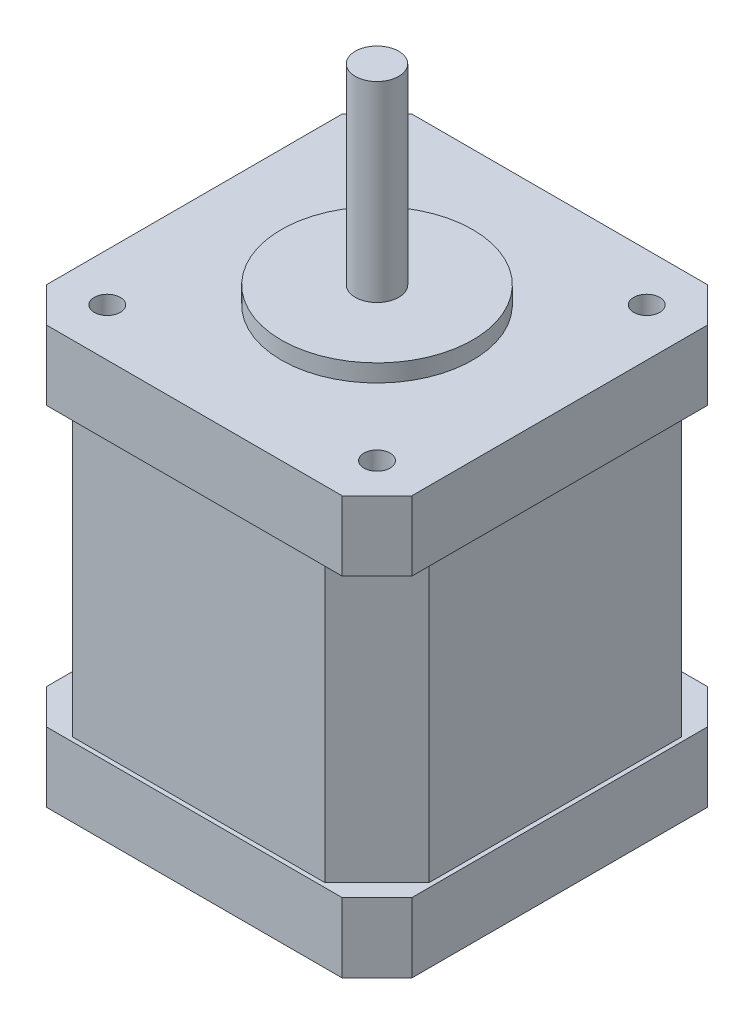
ISO-10303-21;
HEADER;
FILE_DESCRIPTION(('STEP AP214'),'2;1');
FILE_NAME('part.step','',(''),(''),'','','');
FILE_SCHEMA(('AUTOMOTIVE_DESIGN { 1 0 10303 214 1 1 1 1 }'));
ENDSEC;
DATA;
#1=APPLICATION_CONTEXT('core data for automotive mechanical design processes');
#2=APPLICATION_PROTOCOL_DEFINITION('international standard','automotive_design',2000,#1);
#3=PRODUCT_CONTEXT('',#1,'mechanical');
#4=PRODUCT('Part','Part','',(#3));
#5=PRODUCT_RELATED_PRODUCT_CATEGORY('part','',(#4));
#6=PRODUCT_DEFINITION_FORMATION('','',#4);
#7=PRODUCT_DEFINITION_CONTEXT('part definition',#1,'design');
#8=PRODUCT_DEFINITION('design','',#6,#7);
#9=PRODUCT_DEFINITION_SHAPE('','',#8);
#10=(LENGTH_UNIT() NAMED_UNIT(*) SI_UNIT(.MILLI.,.METRE.));
#11=(NAMED_UNIT(*) PLANE_ANGLE_UNIT() SI_UNIT($,.RADIAN.));
#12=(NAMED_UNIT(*) SI_UNIT($,.STERADIAN.) SOLID_ANGLE_UNIT());
#13=UNCERTAINTY_MEASURE_WITH_UNIT(LENGTH_MEASURE(1.E-05),#10,'distance_accuracy_value','');
#14=(GEOMETRIC_REPRESENTATION_CONTEXT(3) GLOBAL_UNCERTAINTY_ASSIGNED_CONTEXT((#13)) GLOBAL_UNIT_ASSIGNED_CONTEXT((#10,
#11,#12)) REPRESENTATION_CONTEXT('',''));
#15=CARTESIAN_POINT('',(0.,0.,0.));
#16=DIRECTION('',(0.,0.,1.));
#17=DIRECTION('',(1.,0.,0.));
#18=AXIS2_PLACEMENT_3D('',#15,#16,#17);
#19=CARTESIAN_POINT('',(0.,10.,0.));
#20=DIRECTION('',(0.,1.,0.));
#21=DIRECTION('',(0.,0.,1.));
#22=AXIS2_PLACEMENT_3D('',#19,#20,#21);
#23=PLANE('',#22);
#24=CARTESIAN_POINT('',(0.,10.,0.));
#25=DIRECTION('',(0.,1.,0.));
#26=DIRECTION('',(0.,0.,1.));
#27=AXIS2_PLACEMENT_3D('',#24,#25,#26);
#28=CIRCLE('',#27,11.);
#29=CARTESIAN_POINT('',(0.,10.,11.));
#30=VERTEX_POINT('',#29);
#31=EDGE_CURVE('E482',#30,#30,#28,.T.);
#32=ORIENTED_EDGE('',*,*,#31,.T.);
#33=EDGE_LOOP('',(#32));
#34=FACE_BOUND('',#33,.T.);
#35=CARTESIAN_POINT('',(0.,10.,0.));
#36=DIRECTION('',(0.,1.,0.));
#37=DIRECTION('',(0.,0.,1.));
#38=AXIS2_PLACEMENT_3D('',#35,#36,#37);
#39=CIRCLE('',#38,2.5);
#40=CARTESIAN_POINT('',(0.,10.,2.5));
#41=VERTEX_POINT('',#40);
#42=EDGE_CURVE('E498',#41,#41,#39,.T.);
#43=ORIENTED_EDGE('',*,*,#42,.F.);
#44=EDGE_LOOP('',(#43));
#45=FACE_BOUND('',#44,.T.);
#46=ADVANCED_FACE('F35',(#34,#45),#23,.T.);
#47=CARTESIAN_POINT('',(0.,8.,0.));
#48=DIRECTION('',(0.,1.,0.));
#49=DIRECTION('',(0.,0.,1.));
#50=AXIS2_PLACEMENT_3D('',#47,#48,#49);
#51=PLANE('',#50);
#52=CARTESIAN_POINT('',(-15.5,8.,15.5));
#53=DIRECTION('',(0.,1.,0.));
#54=DIRECTION('',(0.,0.,1.));
#55=AXIS2_PLACEMENT_3D('',#52,#53,#54);
#56=CIRCLE('',#55,1.5);
#57=CARTESIAN_POINT('',(-15.5,8.,17.));
#58=VERTEX_POINT('',#57);
#59=EDGE_CURVE('E522',#58,#58,#56,.T.);
#60=ORIENTED_EDGE('',*,*,#59,.F.);
#61=EDGE_LOOP('',(#60));
#62=FACE_BOUND('',#61,.T.);
#63=CARTESIAN_POINT('',(15.5,8.,15.5));
#64=DIRECTION('',(0.,1.,0.));
#65=DIRECTION('',(0.,0.,1.));
#66=AXIS2_PLACEMENT_3D('',#63,#64,#65);
#67=CIRCLE('',#66,1.5);
#68=CARTESIAN_POINT('',(15.5,8.,17.));
#69=VERTEX_POINT('',#68);
#70=EDGE_CURVE('E516',#69,#69,#67,.T.);
#71=ORIENTED_EDGE('',*,*,#70,.F.);
#72=EDGE_LOOP('',(#71));
#73=FACE_BOUND('',#72,.T.);
#74=CARTESIAN_POINT('',(15.5,8.,-15.5));
#75=DIRECTION('',(0.,1.,0.));
#76=DIRECTION('',(0.,0.,1.));
#77=AXIS2_PLACEMENT_3D('',#74,#75,#76);
#78=CIRCLE('',#77,1.5);
#79=CARTESIAN_POINT('',(15.5,8.,-14.));
#80=VERTEX_POINT('',#79);
#81=EDGE_CURVE('E510',#80,#80,#78,.T.);
#82=ORIENTED_EDGE('',*,*,#81,.F.);
#83=EDGE_LOOP('',(#82));
#84=FACE_BOUND('',#83,.T.);
#85=CARTESIAN_POINT('',(-15.5,8.,-15.5));
#86=DIRECTION('',(0.,1.,0.));
#87=DIRECTION('',(0.,0.,1.));
#88=AXIS2_PLACEMENT_3D('',#85,#86,#87);
#89=CIRCLE('',#88,1.5);
#90=CARTESIAN_POINT('',(-15.5,8.,-14.));
#91=VERTEX_POINT('',#90);
#92=EDGE_CURVE('E504',#91,#91,#89,.T.);
#93=ORIENTED_EDGE('',*,*,#92,.F.);
#94=EDGE_LOOP('',(#93));
#95=FACE_BOUND('',#94,.T.);
#96=DIRECTION('',(-1.,0.,0.));
#97=VECTOR('',#96,1.);
#98=CARTESIAN_POINT('',(-21.,8.,-21.));
#99=LINE('',#98,#97);
#100=CARTESIAN_POINT('',(17.,8.,-21.));
#101=VERTEX_POINT('',#100);
#102=CARTESIAN_POINT('',(-17.,8.,-21.));
#103=VERTEX_POINT('',#102);
#104=EDGE_CURVE('E208',#101,#103,#99,.T.);
#105=ORIENTED_EDGE('',*,*,#104,.T.);
#106=DIRECTION('',(0.707106781186549,0.,-0.707106781186546));
#107=VECTOR('',#106,1.);
#108=CARTESIAN_POINT('',(-19.,8.,-19.));
#109=LINE('',#108,#107);
#110=CARTESIAN_POINT('',(-21.,8.,-17.));
#111=VERTEX_POINT('',#110);
#112=EDGE_CURVE('E296',#103,#111,#109,.F.);
#113=ORIENTED_EDGE('',*,*,#112,.T.);
#114=DIRECTION('',(0.,0.,1.));
#115=VECTOR('',#114,1.);
#116=CARTESIAN_POINT('',(-21.,8.,-21.));
#117=LINE('',#116,#115);
#118=CARTESIAN_POINT('',(-21.,8.,17.));
#119=VERTEX_POINT('',#118);
#120=EDGE_CURVE('E320',#111,#119,#117,.T.);
#121=ORIENTED_EDGE('',*,*,#120,.T.);
#122=DIRECTION('',(-0.707106781186546,0.,-0.707106781186549));
#123=VECTOR('',#122,1.);
#124=CARTESIAN_POINT('',(-19.,8.,19.));
#125=LINE('',#124,#123);
#126=CARTESIAN_POINT('',(-17.,8.,21.));
#127=VERTEX_POINT('',#126);
#128=EDGE_CURVE('E294',#119,#127,#125,.F.);
#129=ORIENTED_EDGE('',*,*,#128,.T.);
#130=DIRECTION('',(1.,0.,0.));
#131=VECTOR('',#130,1.);
#132=CARTESIAN_POINT('',(-21.,8.,21.));
#133=LINE('',#132,#131);
#134=CARTESIAN_POINT('',(17.,8.,21.));
#135=VERTEX_POINT('',#134);
#136=EDGE_CURVE('E438',#127,#135,#133,.T.);
#137=ORIENTED_EDGE('',*,*,#136,.T.);
#138=DIRECTION('',(-0.707106781186549,0.,0.707106781186546));
#139=VECTOR('',#138,1.);
#140=CARTESIAN_POINT('',(19.,8.,19.));
#141=LINE('',#140,#139);
#142=CARTESIAN_POINT('',(21.,8.,17.));
#143=VERTEX_POINT('',#142);
#144=EDGE_CURVE('E55',#135,#143,#141,.F.);
#145=ORIENTED_EDGE('',*,*,#144,.T.);
#146=DIRECTION('',(0.,0.,-1.));
#147=VECTOR('',#146,1.);
#148=CARTESIAN_POINT('',(21.,8.,-21.));
#149=LINE('',#148,#147);
#150=CARTESIAN_POINT('',(21.,8.,-17.));
#151=VERTEX_POINT('',#150);
#152=EDGE_CURVE('E307',#143,#151,#149,.T.);
#153=ORIENTED_EDGE('',*,*,#152,.T.);
#154=DIRECTION('',(0.707106781186547,0.,0.707106781186548));
#155=VECTOR('',#154,1.);
#156=CARTESIAN_POINT('',(19.,8.,-19.));
#157=LINE('',#156,#155);
#158=EDGE_CURVE('E292',#151,#101,#157,.F.);
#159=ORIENTED_EDGE('',*,*,#158,.T.);
#160=EDGE_LOOP('',(#105,#113,#121,#129,#137,#145,#153,#159));
#161=FACE_BOUND('',#160,.T.);
#162=CARTESIAN_POINT('',(0.,8.,0.));
#163=DIRECTION('',(0.,1.,0.));
#164=DIRECTION('',(0.,0.,1.));
#165=AXIS2_PLACEMENT_3D('',#162,#163,#164);
#166=CIRCLE('',#165,11.);
#167=CARTESIAN_POINT('',(0.,8.,11.));
#168=VERTEX_POINT('',#167);
#169=EDGE_CURVE('E493',#168,#168,#166,.T.);
#170=ORIENTED_EDGE('',*,*,#169,.F.);
#171=EDGE_LOOP('',(#170));
#172=FACE_BOUND('',#171,.T.);
#173=ADVANCED_FACE('F368',(#62,#73,#84,#95,#161,#172),#51,.T.);
#174=CARTESIAN_POINT('',(0.,0.,0.));
#175=DIRECTION('',(0.,1.,0.));
#176=DIRECTION('',(0.,0.,1.));
#177=AXIS2_PLACEMENT_3D('',#174,#175,#176);
#178=PLANE('',#177);
#179=DIRECTION('',(0.,0.,1.));
#180=VECTOR('',#179,1.);
#181=CARTESIAN_POINT('',(-21.,0.,-21.));
#182=LINE('',#181,#180);
#183=CARTESIAN_POINT('',(-21.,0.,-17.));
#184=VERTEX_POINT('',#183);
#185=CARTESIAN_POINT('',(-21.,0.,17.));
#186=VERTEX_POINT('',#185);
#187=EDGE_CURVE('E322',#184,#186,#182,.T.);
#188=ORIENTED_EDGE('',*,*,#187,.F.);
#189=DIRECTION('',(-0.707106781186549,0.,0.707106781186546));
#190=VECTOR('',#189,1.);
#191=CARTESIAN_POINT('',(-21.,0.,-17.));
#192=LINE('',#191,#190);
#193=CARTESIAN_POINT('',(-17.,0.,-21.));
#194=VERTEX_POINT('',#193);
#195=EDGE_CURVE('E284',#184,#194,#192,.F.);
#196=ORIENTED_EDGE('',*,*,#195,.T.);
#197=DIRECTION('',(-1.,0.,0.));
#198=VECTOR('',#197,1.);
#199=CARTESIAN_POINT('',(-21.,0.,-21.));
#200=LINE('',#199,#198);
#201=CARTESIAN_POINT('',(17.,0.,-21.));
#202=VERTEX_POINT('',#201);
#203=EDGE_CURVE('E316',#202,#194,#200,.T.);
#204=ORIENTED_EDGE('',*,*,#203,.F.);
#205=DIRECTION('',(-0.707106781186547,0.,-0.707106781186548));
#206=VECTOR('',#205,1.);
#207=CARTESIAN_POINT('',(17.,0.,-21.));
#208=LINE('',#207,#206);
#209=CARTESIAN_POINT('',(21.,0.,-17.));
#210=VERTEX_POINT('',#209);
#211=EDGE_CURVE('E280',#202,#210,#208,.F.);
#212=ORIENTED_EDGE('',*,*,#211,.T.);
#213=DIRECTION('',(0.,0.,-1.));
#214=VECTOR('',#213,1.);
#215=CARTESIAN_POINT('',(21.,0.,-21.));
#216=LINE('',#215,#214);
#217=CARTESIAN_POINT('',(21.,0.,17.));
#218=VERTEX_POINT('',#217);
#219=EDGE_CURVE('E306',#218,#210,#216,.T.);
#220=ORIENTED_EDGE('',*,*,#219,.F.);
#221=DIRECTION('',(0.707106781186549,0.,-0.707106781186546));
#222=VECTOR('',#221,1.);
#223=CARTESIAN_POINT('',(21.,0.,17.));
#224=LINE('',#223,#222);
#225=CARTESIAN_POINT('',(17.,0.,21.));
#226=VERTEX_POINT('',#225);
#227=EDGE_CURVE('E278',#218,#226,#224,.F.);
#228=ORIENTED_EDGE('',*,*,#227,.T.);
#229=DIRECTION('',(1.,0.,0.));
#230=VECTOR('',#229,1.);
#231=CARTESIAN_POINT('',(-21.,0.,21.));
#232=LINE('',#231,#230);
#233=CARTESIAN_POINT('',(-17.,0.,21.));
#234=VERTEX_POINT('',#233);
#235=EDGE_CURVE('E317',#234,#226,#232,.T.);
#236=ORIENTED_EDGE('',*,*,#235,.F.);
#237=DIRECTION('',(0.707106781186546,0.,0.707106781186549));
#238=VECTOR('',#237,1.);
#239=CARTESIAN_POINT('',(-17.,0.,21.));
#240=LINE('',#239,#238);
#241=EDGE_CURVE('E282',#234,#186,#240,.F.);
#242=ORIENTED_EDGE('',*,*,#241,.T.);
#243=EDGE_LOOP('',(#188,#196,#204,#212,#220,#228,#236,#242));
#244=FACE_BOUND('',#243,.T.);
#245=DIRECTION('',(-1.,0.,0.));
#246=VECTOR('',#245,1.);
#247=CARTESIAN_POINT('',(20.5,0.,20.5));
#248=LINE('',#247,#246);
#249=CARTESIAN_POINT('',(14.5,0.,20.5));
#250=VERTEX_POINT('',#249);
#251=CARTESIAN_POINT('',(-14.5,0.,20.5));
#252=VERTEX_POINT('',#251);
#253=EDGE_CURVE('E454',#250,#252,#248,.T.);
#254=ORIENTED_EDGE('',*,*,#253,.F.);
#255=DIRECTION('',(-0.707106781186546,0.,0.707106781186549));
#256=VECTOR('',#255,1.);
#257=CARTESIAN_POINT('',(17.5,0.,17.5));
#258=LINE('',#257,#256);
#259=CARTESIAN_POINT('',(20.5,0.,14.5));
#260=VERTEX_POINT('',#259);
#261=EDGE_CURVE('E225',#250,#260,#258,.F.);
#262=ORIENTED_EDGE('',*,*,#261,.T.);
#263=DIRECTION('',(0.,0.,1.));
#264=VECTOR('',#263,1.);
#265=CARTESIAN_POINT('',(20.5,0.,-20.5));
#266=LINE('',#265,#264);
#267=CARTESIAN_POINT('',(20.5,0.,-14.5));
#268=VERTEX_POINT('',#267);
#269=EDGE_CURVE('E204',#268,#260,#266,.T.);
#270=ORIENTED_EDGE('',*,*,#269,.F.);
#271=DIRECTION('',(0.707106781186549,0.,0.707106781186546));
#272=VECTOR('',#271,1.);
#273=CARTESIAN_POINT('',(17.4999999999999,0.,-17.5));
#274=LINE('',#273,#272);
#275=CARTESIAN_POINT('',(14.5,0.,-20.5));
#276=VERTEX_POINT('',#275);
#277=EDGE_CURVE('E340',#268,#276,#274,.F.);
#278=ORIENTED_EDGE('',*,*,#277,.T.);
#279=DIRECTION('',(1.,0.,0.));
#280=VECTOR('',#279,1.);
#281=CARTESIAN_POINT('',(-20.5,0.,-20.5));
#282=LINE('',#281,#280);
#283=CARTESIAN_POINT('',(-14.5,0.,-20.5));
#284=VERTEX_POINT('',#283);
#285=EDGE_CURVE('E344',#284,#276,#282,.T.);
#286=ORIENTED_EDGE('',*,*,#285,.F.);
#287=DIRECTION('',(0.707106781186546,0.,-0.707106781186549));
#288=VECTOR('',#287,1.);
#289=CARTESIAN_POINT('',(-17.5,0.,-17.5));
#290=LINE('',#289,#288);
#291=CARTESIAN_POINT('',(-20.5,0.,-14.5));
#292=VERTEX_POINT('',#291);
#293=EDGE_CURVE('E233',#284,#292,#290,.F.);
#294=ORIENTED_EDGE('',*,*,#293,.T.);
#295=DIRECTION('',(0.,0.,-1.));
#296=VECTOR('',#295,1.);
#297=CARTESIAN_POINT('',(-20.5,0.,20.5));
#298=LINE('',#297,#296);
#299=CARTESIAN_POINT('',(-20.5,0.,14.5));
#300=VERTEX_POINT('',#299);
#301=EDGE_CURVE('E351',#300,#292,#298,.T.);
#302=ORIENTED_EDGE('',*,*,#301,.F.);
#303=DIRECTION('',(-0.707106781186549,0.,-0.707106781186546));
#304=VECTOR('',#303,1.);
#305=CARTESIAN_POINT('',(-17.4999999999999,0.,17.5));
#306=LINE('',#305,#304);
#307=EDGE_CURVE('E224',#300,#252,#306,.F.);
#308=ORIENTED_EDGE('',*,*,#307,.T.);
#309=EDGE_LOOP('',(#254,#262,#270,#278,#286,#294,#302,#308));
#310=FACE_BOUND('',#309,.T.);
#311=ADVANCED_FACE('F311',(#244,#310),#178,.F.);
#312=CARTESIAN_POINT('',(-21.,8.,-21.));
#313=DIRECTION('',(1.,0.,0.));
#314=DIRECTION('',(0.,0.,-1.));
#315=AXIS2_PLACEMENT_3D('',#312,#313,#314);
#316=PLANE('',#315);
#317=ORIENTED_EDGE('',*,*,#120,.F.);
#318=DIRECTION('',(0.,-1.,0.));
#319=VECTOR('',#318,1.);
#320=CARTESIAN_POINT('',(-21.,8.,-17.));
#321=LINE('',#320,#319);
#322=EDGE_CURVE('E275',#111,#184,#321,.T.);
#323=ORIENTED_EDGE('',*,*,#322,.T.);
#324=ORIENTED_EDGE('',*,*,#187,.T.);
#325=DIRECTION('',(0.,1.,0.));
#326=VECTOR('',#325,1.);
#327=CARTESIAN_POINT('',(-21.,8.,17.));
#328=LINE('',#327,#326);
#329=EDGE_CURVE('E273',#186,#119,#328,.T.);
#330=ORIENTED_EDGE('',*,*,#329,.T.);
#331=EDGE_LOOP('',(#317,#323,#324,#330));
#332=FACE_BOUND('',#331,.T.);
#333=ADVANCED_FACE('F419',(#332),#316,.F.);
#334=CARTESIAN_POINT('',(-21.,8.,21.));
#335=DIRECTION('',(0.,0.,-1.));
#336=DIRECTION('',(-1.,0.,0.));
#337=AXIS2_PLACEMENT_3D('',#334,#335,#336);
#338=PLANE('',#337);
#339=ORIENTED_EDGE('',*,*,#136,.F.);
#340=DIRECTION('',(0.,-1.,0.));
#341=VECTOR('',#340,1.);
#342=CARTESIAN_POINT('',(-17.,8.,21.));
#343=LINE('',#342,#341);
#344=EDGE_CURVE('E300',#127,#234,#343,.T.);
#345=ORIENTED_EDGE('',*,*,#344,.T.);
#346=ORIENTED_EDGE('',*,*,#235,.T.);
#347=DIRECTION('',(0.,1.,0.));
#348=VECTOR('',#347,1.);
#349=CARTESIAN_POINT('',(17.,8.,21.));
#350=LINE('',#349,#348);
#351=EDGE_CURVE('E298',#226,#135,#350,.T.);
#352=ORIENTED_EDGE('',*,*,#351,.T.);
#353=EDGE_LOOP('',(#339,#345,#346,#352));
#354=FACE_BOUND('',#353,.T.);
#355=ADVANCED_FACE('F425',(#354),#338,.F.);
#356=CARTESIAN_POINT('',(21.,8.,-21.));
#357=DIRECTION('',(-1.,0.,0.));
#358=DIRECTION('',(0.,0.,1.));
#359=AXIS2_PLACEMENT_3D('',#356,#357,#358);
#360=PLANE('',#359);
#361=ORIENTED_EDGE('',*,*,#219,.T.);
#362=DIRECTION('',(0.,1.,0.));
#363=VECTOR('',#362,1.);
#364=CARTESIAN_POINT('',(21.,8.,-17.));
#365=LINE('',#364,#363);
#366=EDGE_CURVE('E11',#210,#151,#365,.T.);
#367=ORIENTED_EDGE('',*,*,#366,.T.);
#368=ORIENTED_EDGE('',*,*,#152,.F.);
#369=DIRECTION('',(0.,-1.,0.));
#370=VECTOR('',#369,1.);
#371=CARTESIAN_POINT('',(21.,8.,17.));
#372=LINE('',#371,#370);
#373=EDGE_CURVE('E43',#143,#218,#372,.T.);
#374=ORIENTED_EDGE('',*,*,#373,.T.);
#375=EDGE_LOOP('',(#361,#367,#368,#374));
#376=FACE_BOUND('',#375,.T.);
#377=ADVANCED_FACE('F305',(#376),#360,.F.);
#378=CARTESIAN_POINT('',(-21.,8.,-21.));
#379=DIRECTION('',(0.,0.,1.));
#380=DIRECTION('',(1.,0.,0.));
#381=AXIS2_PLACEMENT_3D('',#378,#379,#380);
#382=PLANE('',#381);
#383=ORIENTED_EDGE('',*,*,#203,.T.);
#384=DIRECTION('',(0.,1.,0.));
#385=VECTOR('',#384,1.);
#386=CARTESIAN_POINT('',(-17.,8.,-21.));
#387=LINE('',#386,#385);
#388=EDGE_CURVE('E289',#194,#103,#387,.T.);
#389=ORIENTED_EDGE('',*,*,#388,.T.);
#390=ORIENTED_EDGE('',*,*,#104,.F.);
#391=DIRECTION('',(0.,-1.,0.));
#392=VECTOR('',#391,1.);
#393=CARTESIAN_POINT('',(17.,8.,-21.));
#394=LINE('',#393,#392);
#395=EDGE_CURVE('E286',#101,#202,#394,.T.);
#396=ORIENTED_EDGE('',*,*,#395,.T.);
#397=EDGE_LOOP('',(#383,#389,#390,#396));
#398=FACE_BOUND('',#397,.T.);
#399=ADVANCED_FACE('F413',(#398),#382,.F.);
#400=CARTESIAN_POINT('',(20.5,-500000.,20.5));
#401=DIRECTION('',(0.,0.,-1.));
#402=DIRECTION('',(-1.,0.,0.));
#403=AXIS2_PLACEMENT_3D('',#400,#401,#402);
#404=PLANE('',#403);
#405=DIRECTION('',(1.,0.,0.));
#406=VECTOR('',#405,1.);
#407=CARTESIAN_POINT('',(20.5,-31.9999999999823,20.5));
#408=LINE('',#407,#406);
#409=CARTESIAN_POINT('',(-14.5,-31.9999999999823,20.5));
#410=VERTEX_POINT('',#409);
#411=CARTESIAN_POINT('',(14.5,-31.9999999999823,20.5));
#412=VERTEX_POINT('',#411);
#413=EDGE_CURVE('E466',#410,#412,#408,.T.);
#414=ORIENTED_EDGE('',*,*,#413,.T.);
#415=DIRECTION('',(0.,1.,0.));
#416=VECTOR('',#415,1.);
#417=CARTESIAN_POINT('',(14.5,-500000.,20.5));
#418=LINE('',#417,#416);
#419=EDGE_CURVE('E223',#412,#250,#418,.T.);
#420=ORIENTED_EDGE('',*,*,#419,.T.);
#421=ORIENTED_EDGE('',*,*,#253,.T.);
#422=DIRECTION('',(0.,-1.,0.));
#423=VECTOR('',#422,1.);
#424=CARTESIAN_POINT('',(-14.5,-500000.,20.5));
#425=LINE('',#424,#423);
#426=EDGE_CURVE('E332',#252,#410,#425,.T.);
#427=ORIENTED_EDGE('',*,*,#426,.T.);
#428=EDGE_LOOP('',(#414,#420,#421,#427));
#429=FACE_BOUND('',#428,.T.);
#430=ADVANCED_FACE('F389',(#429),#404,.F.);
#431=CARTESIAN_POINT('',(-20.5,-500000.,20.5));
#432=DIRECTION('',(1.,0.,0.));
#433=DIRECTION('',(0.,0.,-1.));
#434=AXIS2_PLACEMENT_3D('',#431,#432,#433);
#435=PLANE('',#434);
#436=DIRECTION('',(0.,0.,1.));
#437=VECTOR('',#436,1.);
#438=CARTESIAN_POINT('',(-20.5,-31.9999999999823,20.5));
#439=LINE('',#438,#437);
#440=CARTESIAN_POINT('',(-20.5,-31.9999999999823,-14.5));
#441=VERTEX_POINT('',#440);
#442=CARTESIAN_POINT('',(-20.5,-31.9999999999823,14.5));
#443=VERTEX_POINT('',#442);
#444=EDGE_CURVE('E463',#441,#443,#439,.T.);
#445=ORIENTED_EDGE('',*,*,#444,.T.);
#446=DIRECTION('',(0.,1.,0.));
#447=VECTOR('',#446,1.);
#448=CARTESIAN_POINT('',(-20.5,-500000.,14.5));
#449=LINE('',#448,#447);
#450=EDGE_CURVE('E337',#443,#300,#449,.T.);
#451=ORIENTED_EDGE('',*,*,#450,.T.);
#452=ORIENTED_EDGE('',*,*,#301,.T.);
#453=DIRECTION('',(0.,-1.,0.));
#454=VECTOR('',#453,1.);
#455=CARTESIAN_POINT('',(-20.5,-500000.,-14.5));
#456=LINE('',#455,#454);
#457=EDGE_CURVE('E335',#292,#441,#456,.T.);
#458=ORIENTED_EDGE('',*,*,#457,.T.);
#459=EDGE_LOOP('',(#445,#451,#452,#458));
#460=FACE_BOUND('',#459,.T.);
#461=ADVANCED_FACE('F405',(#460),#435,.F.);
#462=CARTESIAN_POINT('',(-20.5,-500000.,-20.5));
#463=DIRECTION('',(0.,0.,1.));
#464=DIRECTION('',(1.,0.,0.));
#465=AXIS2_PLACEMENT_3D('',#462,#463,#464);
#466=PLANE('',#465);
#467=ORIENTED_EDGE('',*,*,#285,.T.);
#468=DIRECTION('',(0.,-1.,0.));
#469=VECTOR('',#468,1.);
#470=CARTESIAN_POINT('',(14.5,-500000.,-20.5));
#471=LINE('',#470,#469);
#472=CARTESIAN_POINT('',(14.5,-31.9999999999823,-20.5));
#473=VERTEX_POINT('',#472);
#474=EDGE_CURVE('E330',#276,#473,#471,.T.);
#475=ORIENTED_EDGE('',*,*,#474,.T.);
#476=DIRECTION('',(-1.,0.,0.));
#477=VECTOR('',#476,1.);
#478=CARTESIAN_POINT('',(-20.5,-31.9999999999823,-20.5));
#479=LINE('',#478,#477);
#480=CARTESIAN_POINT('',(-14.5,-31.9999999999823,-20.5));
#481=VERTEX_POINT('',#480);
#482=EDGE_CURVE('E218',#473,#481,#479,.T.);
#483=ORIENTED_EDGE('',*,*,#482,.T.);
#484=DIRECTION('',(0.,1.,0.));
#485=VECTOR('',#484,1.);
#486=CARTESIAN_POINT('',(-14.5,-500000.,-20.5));
#487=LINE('',#486,#485);
#488=EDGE_CURVE('E327',#481,#284,#487,.T.);
#489=ORIENTED_EDGE('',*,*,#488,.T.);
#490=EDGE_LOOP('',(#467,#475,#483,#489));
#491=FACE_BOUND('',#490,.T.);
#492=ADVANCED_FACE('F348',(#491),#466,.F.);
#493=CARTESIAN_POINT('',(20.5,-500000.,-20.5));
#494=DIRECTION('',(-1.,0.,0.));
#495=DIRECTION('',(0.,0.,1.));
#496=AXIS2_PLACEMENT_3D('',#493,#494,#495);
#497=PLANE('',#496);
#498=DIRECTION('',(0.,0.,-1.));
#499=VECTOR('',#498,1.);
#500=CARTESIAN_POINT('',(20.5,-31.9999999999823,-20.5));
#501=LINE('',#500,#499);
#502=CARTESIAN_POINT('',(20.5,-31.9999999999823,14.5));
#503=VERTEX_POINT('',#502);
#504=CARTESIAN_POINT('',(20.5,-31.9999999999823,-14.5));
#505=VERTEX_POINT('',#504);
#506=EDGE_CURVE('E201',#503,#505,#501,.T.);
#507=ORIENTED_EDGE('',*,*,#506,.T.);
#508=DIRECTION('',(0.,1.,0.));
#509=VECTOR('',#508,1.);
#510=CARTESIAN_POINT('',(20.5,-500000.,-14.5));
#511=LINE('',#510,#509);
#512=EDGE_CURVE('E207',#505,#268,#511,.T.);
#513=ORIENTED_EDGE('',*,*,#512,.T.);
#514=ORIENTED_EDGE('',*,*,#269,.T.);
#515=DIRECTION('',(0.,-1.,0.));
#516=VECTOR('',#515,1.);
#517=CARTESIAN_POINT('',(20.5,-500000.,14.5));
#518=LINE('',#517,#516);
#519=EDGE_CURVE('E197',#260,#503,#518,.T.);
#520=ORIENTED_EDGE('',*,*,#519,.T.);
#521=EDGE_LOOP('',(#507,#513,#514,#520));
#522=FACE_BOUND('',#521,.T.);
#523=ADVANCED_FACE('F199',(#522),#497,.F.);
#524=CARTESIAN_POINT('',(0.,-32.,0.));
#525=DIRECTION('',(0.,1.,0.));
#526=DIRECTION('',(0.,0.,1.));
#527=AXIS2_PLACEMENT_3D('',#524,#525,#526);
#528=PLANE('',#527);
#529=DIRECTION('',(-1.,0.,0.));
#530=VECTOR('',#529,1.);
#531=CARTESIAN_POINT('',(-21.,-32.,-21.));
#532=LINE('',#531,#530);
#533=CARTESIAN_POINT('',(17.,-32.,-21.));
#534=VERTEX_POINT('',#533);
#535=CARTESIAN_POINT('',(-17.,-32.,-21.));
#536=VERTEX_POINT('',#535);
#537=EDGE_CURVE('E468',#534,#536,#532,.T.);
#538=ORIENTED_EDGE('',*,*,#537,.T.);
#539=DIRECTION('',(0.707106781186549,0.,-0.707106781186546));
#540=VECTOR('',#539,1.);
#541=CARTESIAN_POINT('',(-19.,-32.,-19.));
#542=LINE('',#541,#540);
#543=CARTESIAN_POINT('',(-21.,-32.,-17.));
#544=VERTEX_POINT('',#543);
#545=EDGE_CURVE('E261',#536,#544,#542,.F.);
#546=ORIENTED_EDGE('',*,*,#545,.T.);
#547=DIRECTION('',(0.,0.,1.));
#548=VECTOR('',#547,1.);
#549=CARTESIAN_POINT('',(-21.,-32.,-21.));
#550=LINE('',#549,#548);
#551=CARTESIAN_POINT('',(-21.,-32.,17.));
#552=VERTEX_POINT('',#551);
#553=EDGE_CURVE('E472',#544,#552,#550,.T.);
#554=ORIENTED_EDGE('',*,*,#553,.T.);
#555=DIRECTION('',(-0.707106781186546,0.,-0.707106781186549));
#556=VECTOR('',#555,1.);
#557=CARTESIAN_POINT('',(-19.,-32.,19.));
#558=LINE('',#557,#556);
#559=CARTESIAN_POINT('',(-17.,-32.,21.));
#560=VERTEX_POINT('',#559);
#561=EDGE_CURVE('E259',#552,#560,#558,.F.);
#562=ORIENTED_EDGE('',*,*,#561,.T.);
#563=DIRECTION('',(1.,0.,0.));
#564=VECTOR('',#563,1.);
#565=CARTESIAN_POINT('',(-21.,-32.,21.));
#566=LINE('',#565,#564);
#567=CARTESIAN_POINT('',(17.,-32.,21.));
#568=VERTEX_POINT('',#567);
#569=EDGE_CURVE('E488',#560,#568,#566,.T.);
#570=ORIENTED_EDGE('',*,*,#569,.T.);
#571=DIRECTION('',(-0.707106781186549,0.,0.707106781186546));
#572=VECTOR('',#571,1.);
#573=CARTESIAN_POINT('',(19.,-32.,19.));
#574=LINE('',#573,#572);
#575=CARTESIAN_POINT('',(21.,-32.,17.));
#576=VERTEX_POINT('',#575);
#577=EDGE_CURVE('E255',#568,#576,#574,.F.);
#578=ORIENTED_EDGE('',*,*,#577,.T.);
#579=DIRECTION('',(0.,0.,-1.));
#580=VECTOR('',#579,1.);
#581=CARTESIAN_POINT('',(21.,-32.,-21.));
#582=LINE('',#581,#580);
#583=CARTESIAN_POINT('',(21.,-32.,-17.));
#584=VERTEX_POINT('',#583);
#585=EDGE_CURVE('E485',#576,#584,#582,.T.);
#586=ORIENTED_EDGE('',*,*,#585,.T.);
#587=DIRECTION('',(0.707106781186547,0.,0.707106781186548));
#588=VECTOR('',#587,1.);
#589=CARTESIAN_POINT('',(19.,-32.,-19.));
#590=LINE('',#589,#588);
#591=EDGE_CURVE('E257',#584,#534,#590,.F.);
#592=ORIENTED_EDGE('',*,*,#591,.T.);
#593=EDGE_LOOP('',(#538,#546,#554,#562,#570,#578,#586,#592));
#594=FACE_BOUND('',#593,.T.);
#595=ORIENTED_EDGE('',*,*,#413,.F.);
#596=DIRECTION('',(0.707106781186549,0.,0.707106781186546));
#597=VECTOR('',#596,1.);
#598=CARTESIAN_POINT('',(-20.5,-31.9999999999823,14.5));
#599=LINE('',#598,#597);
#600=EDGE_CURVE('E227',#410,#443,#599,.F.);
#601=ORIENTED_EDGE('',*,*,#600,.T.);
#602=ORIENTED_EDGE('',*,*,#444,.F.);
#603=DIRECTION('',(-0.707106781186546,0.,0.707106781186549));
#604=VECTOR('',#603,1.);
#605=CARTESIAN_POINT('',(-14.5,-31.9999999999823,-20.5));
#606=LINE('',#605,#604);
#607=EDGE_CURVE('E235',#441,#481,#606,.F.);
#608=ORIENTED_EDGE('',*,*,#607,.T.);
#609=ORIENTED_EDGE('',*,*,#482,.F.);
#610=DIRECTION('',(-0.707106781186549,0.,-0.707106781186546));
#611=VECTOR('',#610,1.);
#612=CARTESIAN_POINT('',(20.5,-31.9999999999823,-14.5));
#613=LINE('',#612,#611);
#614=EDGE_CURVE('E217',#473,#505,#613,.F.);
#615=ORIENTED_EDGE('',*,*,#614,.T.);
#616=ORIENTED_EDGE('',*,*,#506,.F.);
#617=DIRECTION('',(0.707106781186546,0.,-0.707106781186549));
#618=VECTOR('',#617,1.);
#619=CARTESIAN_POINT('',(14.5,-31.9999999999823,20.5));
#620=LINE('',#619,#618);
#621=EDGE_CURVE('E213',#503,#412,#620,.F.);
#622=ORIENTED_EDGE('',*,*,#621,.T.);
#623=EDGE_LOOP('',(#595,#601,#602,#608,#609,#615,#616,#622));
#624=FACE_BOUND('',#623,.T.);
#625=ADVANCED_FACE('F212',(#594,#624),#528,.T.);
#626=CARTESIAN_POINT('',(-21.,-32.,-21.));
#627=DIRECTION('',(1.,0.,0.));
#628=DIRECTION('',(0.,0.,-1.));
#629=AXIS2_PLACEMENT_3D('',#626,#627,#628);
#630=PLANE('',#629);
#631=ORIENTED_EDGE('',*,*,#553,.F.);
#632=DIRECTION('',(0.,-1.,0.));
#633=VECTOR('',#632,1.);
#634=CARTESIAN_POINT('',(-21.,-32.,-17.));
#635=LINE('',#634,#633);
#636=CARTESIAN_POINT('',(-21.,-40.,-17.));
#637=VERTEX_POINT('',#636);
#638=EDGE_CURVE('E239',#544,#637,#635,.T.);
#639=ORIENTED_EDGE('',*,*,#638,.T.);
#640=DIRECTION('',(0.,0.,1.));
#641=VECTOR('',#640,1.);
#642=CARTESIAN_POINT('',(-21.,-40.,-21.));
#643=LINE('',#642,#641);
#644=CARTESIAN_POINT('',(-21.,-40.,17.));
#645=VERTEX_POINT('',#644);
#646=EDGE_CURVE('E479',#637,#645,#643,.T.);
#647=ORIENTED_EDGE('',*,*,#646,.T.);
#648=DIRECTION('',(0.,1.,0.));
#649=VECTOR('',#648,1.);
#650=CARTESIAN_POINT('',(-21.,-32.,17.));
#651=LINE('',#650,#649);
#652=EDGE_CURVE('E237',#645,#552,#651,.T.);
#653=ORIENTED_EDGE('',*,*,#652,.T.);
#654=EDGE_LOOP('',(#631,#639,#647,#653));
#655=FACE_BOUND('',#654,.T.);
#656=ADVANCED_FACE('F387',(#655),#630,.F.);
#657=CARTESIAN_POINT('',(-21.,-32.,21.));
#658=DIRECTION('',(0.,0.,-1.));
#659=DIRECTION('',(-1.,0.,0.));
#660=AXIS2_PLACEMENT_3D('',#657,#658,#659);
#661=PLANE('',#660);
#662=ORIENTED_EDGE('',*,*,#569,.F.);
#663=DIRECTION('',(0.,-1.,0.));
#664=VECTOR('',#663,1.);
#665=CARTESIAN_POINT('',(-17.,-32.,21.));
#666=LINE('',#665,#664);
#667=CARTESIAN_POINT('',(-17.,-40.,21.));
#668=VERTEX_POINT('',#667);
#669=EDGE_CURVE('E265',#560,#668,#666,.T.);
#670=ORIENTED_EDGE('',*,*,#669,.T.);
#671=DIRECTION('',(1.,0.,0.));
#672=VECTOR('',#671,1.);
#673=CARTESIAN_POINT('',(-21.,-40.,21.));
#674=LINE('',#673,#672);
#675=CARTESIAN_POINT('',(17.,-40.,21.));
#676=VERTEX_POINT('',#675);
#677=EDGE_CURVE('E476',#668,#676,#674,.T.);
#678=ORIENTED_EDGE('',*,*,#677,.T.);
#679=DIRECTION('',(0.,1.,0.));
#680=VECTOR('',#679,1.);
#681=CARTESIAN_POINT('',(17.,-32.,21.));
#682=LINE('',#681,#680);
#683=EDGE_CURVE('E263',#676,#568,#682,.T.);
#684=ORIENTED_EDGE('',*,*,#683,.T.);
#685=EDGE_LOOP('',(#662,#670,#678,#684));
#686=FACE_BOUND('',#685,.T.);
#687=ADVANCED_FACE('F397',(#686),#661,.F.);
#688=CARTESIAN_POINT('',(21.,-32.,-21.));
#689=DIRECTION('',(-1.,0.,0.));
#690=DIRECTION('',(0.,0.,1.));
#691=AXIS2_PLACEMENT_3D('',#688,#689,#690);
#692=PLANE('',#691);
#693=DIRECTION('',(0.,0.,-1.));
#694=VECTOR('',#693,1.);
#695=CARTESIAN_POINT('',(21.,-40.,-21.));
#696=LINE('',#695,#694);
#697=CARTESIAN_POINT('',(21.,-40.,17.));
#698=VERTEX_POINT('',#697);
#699=CARTESIAN_POINT('',(21.,-40.,-17.));
#700=VERTEX_POINT('',#699);
#701=EDGE_CURVE('E473',#698,#700,#696,.T.);
#702=ORIENTED_EDGE('',*,*,#701,.T.);
#703=DIRECTION('',(0.,1.,0.));
#704=VECTOR('',#703,1.);
#705=CARTESIAN_POINT('',(21.,-32.,-17.));
#706=LINE('',#705,#704);
#707=EDGE_CURVE('E271',#700,#584,#706,.T.);
#708=ORIENTED_EDGE('',*,*,#707,.T.);
#709=ORIENTED_EDGE('',*,*,#585,.F.);
#710=DIRECTION('',(0.,-1.,0.));
#711=VECTOR('',#710,1.);
#712=CARTESIAN_POINT('',(21.,-32.,17.));
#713=LINE('',#712,#711);
#714=EDGE_CURVE('E268',#576,#698,#713,.T.);
#715=ORIENTED_EDGE('',*,*,#714,.T.);
#716=EDGE_LOOP('',(#702,#708,#709,#715));
#717=FACE_BOUND('',#716,.T.);
#718=ADVANCED_FACE('F393',(#717),#692,.F.);
#719=CARTESIAN_POINT('',(-21.,-32.,-21.));
#720=DIRECTION('',(0.,0.,1.));
#721=DIRECTION('',(1.,0.,0.));
#722=AXIS2_PLACEMENT_3D('',#719,#720,#721);
#723=PLANE('',#722);
#724=DIRECTION('',(-1.,0.,0.));
#725=VECTOR('',#724,1.);
#726=CARTESIAN_POINT('',(-21.,-40.,-21.));
#727=LINE('',#726,#725);
#728=CARTESIAN_POINT('',(17.,-40.,-21.));
#729=VERTEX_POINT('',#728);
#730=CARTESIAN_POINT('',(-17.,-40.,-21.));
#731=VERTEX_POINT('',#730);
#732=EDGE_CURVE('E469',#729,#731,#727,.T.);
#733=ORIENTED_EDGE('',*,*,#732,.T.);
#734=DIRECTION('',(0.,1.,0.));
#735=VECTOR('',#734,1.);
#736=CARTESIAN_POINT('',(-17.,-32.,-21.));
#737=LINE('',#736,#735);
#738=EDGE_CURVE('E253',#731,#536,#737,.T.);
#739=ORIENTED_EDGE('',*,*,#738,.T.);
#740=ORIENTED_EDGE('',*,*,#537,.F.);
#741=DIRECTION('',(0.,-1.,0.));
#742=VECTOR('',#741,1.);
#743=CARTESIAN_POINT('',(17.,-32.,-21.));
#744=LINE('',#743,#742);
#745=EDGE_CURVE('E250',#534,#729,#744,.T.);
#746=ORIENTED_EDGE('',*,*,#745,.T.);
#747=EDGE_LOOP('',(#733,#739,#740,#746));
#748=FACE_BOUND('',#747,.T.);
#749=ADVANCED_FACE('F363',(#748),#723,.F.);
#750=CARTESIAN_POINT('',(0.,-40.,0.));
#751=DIRECTION('',(0.,1.,0.));
#752=DIRECTION('',(0.,0.,1.));
#753=AXIS2_PLACEMENT_3D('',#750,#751,#752);
#754=PLANE('',#753);
#755=ORIENTED_EDGE('',*,*,#646,.F.);
#756=DIRECTION('',(-0.707106781186549,0.,0.707106781186546));
#757=VECTOR('',#756,1.);
#758=CARTESIAN_POINT('',(-21.,-40.,-17.));
#759=LINE('',#758,#757);
#760=EDGE_CURVE('E248',#637,#731,#759,.F.);
#761=ORIENTED_EDGE('',*,*,#760,.T.);
#762=ORIENTED_EDGE('',*,*,#732,.F.);
#763=DIRECTION('',(-0.707106781186547,0.,-0.707106781186548));
#764=VECTOR('',#763,1.);
#765=CARTESIAN_POINT('',(17.,-40.,-21.));
#766=LINE('',#765,#764);
#767=EDGE_CURVE('E244',#729,#700,#766,.F.);
#768=ORIENTED_EDGE('',*,*,#767,.T.);
#769=ORIENTED_EDGE('',*,*,#701,.F.);
#770=DIRECTION('',(0.707106781186549,0.,-0.707106781186546));
#771=VECTOR('',#770,1.);
#772=CARTESIAN_POINT('',(21.,-40.,17.));
#773=LINE('',#772,#771);
#774=EDGE_CURVE('E242',#698,#676,#773,.F.);
#775=ORIENTED_EDGE('',*,*,#774,.T.);
#776=ORIENTED_EDGE('',*,*,#677,.F.);
#777=DIRECTION('',(0.707106781186546,0.,0.707106781186549));
#778=VECTOR('',#777,1.);
#779=CARTESIAN_POINT('',(-17.,-40.,21.));
#780=LINE('',#779,#778);
#781=EDGE_CURVE('E246',#668,#645,#780,.F.);
#782=ORIENTED_EDGE('',*,*,#781,.T.);
#783=EDGE_LOOP('',(#755,#761,#762,#768,#769,#775,#776,#782));
#784=FACE_BOUND('',#783,.T.);
#785=ADVANCED_FACE('F355',(#784),#754,.F.);
#786=CARTESIAN_POINT('',(20.5,-500000.,-14.5));
#787=DIRECTION('',(-0.707106781186546,0.,0.707106781186549));
#788=DIRECTION('',(0.,1.,0.));
#789=AXIS2_PLACEMENT_3D('',#786,#787,#788);
#790=PLANE('',#789);
#791=ORIENTED_EDGE('',*,*,#614,.F.);
#792=ORIENTED_EDGE('',*,*,#474,.F.);
#793=ORIENTED_EDGE('',*,*,#277,.F.);
#794=ORIENTED_EDGE('',*,*,#512,.F.);
#795=EDGE_LOOP('',(#791,#792,#793,#794));
#796=FACE_BOUND('',#795,.T.);
#797=ADVANCED_FACE('F353',(#796),#790,.F.);
#798=CARTESIAN_POINT('',(14.5,-500000.,20.5));
#799=DIRECTION('',(-0.707106781186549,0.,-0.707106781186546));
#800=DIRECTION('',(0.,1.,0.));
#801=AXIS2_PLACEMENT_3D('',#798,#799,#800);
#802=PLANE('',#801);
#803=ORIENTED_EDGE('',*,*,#621,.F.);
#804=ORIENTED_EDGE('',*,*,#519,.F.);
#805=ORIENTED_EDGE('',*,*,#261,.F.);
#806=ORIENTED_EDGE('',*,*,#419,.F.);
#807=EDGE_LOOP('',(#803,#804,#805,#806));
#808=FACE_BOUND('',#807,.T.);
#809=ADVANCED_FACE('F221',(#808),#802,.F.);
#810=CARTESIAN_POINT('',(-20.5,-500000.,14.5));
#811=DIRECTION('',(0.707106781186546,0.,-0.707106781186549));
#812=DIRECTION('',(0.,1.,0.));
#813=AXIS2_PLACEMENT_3D('',#810,#811,#812);
#814=PLANE('',#813);
#815=ORIENTED_EDGE('',*,*,#600,.F.);
#816=ORIENTED_EDGE('',*,*,#426,.F.);
#817=ORIENTED_EDGE('',*,*,#307,.F.);
#818=ORIENTED_EDGE('',*,*,#450,.F.);
#819=EDGE_LOOP('',(#815,#816,#817,#818));
#820=FACE_BOUND('',#819,.T.);
#821=ADVANCED_FACE('F361',(#820),#814,.F.);
#822=CARTESIAN_POINT('',(-14.5,-500000.,-20.5));
#823=DIRECTION('',(0.707106781186549,0.,0.707106781186546));
#824=DIRECTION('',(0.,1.,0.));
#825=AXIS2_PLACEMENT_3D('',#822,#823,#824);
#826=PLANE('',#825);
#827=ORIENTED_EDGE('',*,*,#607,.F.);
#828=ORIENTED_EDGE('',*,*,#457,.F.);
#829=ORIENTED_EDGE('',*,*,#293,.F.);
#830=ORIENTED_EDGE('',*,*,#488,.F.);
#831=EDGE_LOOP('',(#827,#828,#829,#830));
#832=FACE_BOUND('',#831,.T.);
#833=ADVANCED_FACE('F706',(#832),#826,.F.);
#834=CARTESIAN_POINT('',(-21.,-32.,-17.));
#835=DIRECTION('',(0.707106781186546,0.,0.707106781186549));
#836=DIRECTION('',(0.,-1.,0.));
#837=AXIS2_PLACEMENT_3D('',#834,#835,#836);
#838=PLANE('',#837);
#839=ORIENTED_EDGE('',*,*,#545,.F.);
#840=ORIENTED_EDGE('',*,*,#738,.F.);
#841=ORIENTED_EDGE('',*,*,#760,.F.);
#842=ORIENTED_EDGE('',*,*,#638,.F.);
#843=EDGE_LOOP('',(#839,#840,#841,#842));
#844=FACE_BOUND('',#843,.T.);
#845=ADVANCED_FACE('F696',(#844),#838,.F.);
#846=CARTESIAN_POINT('',(-17.,-32.,21.));
#847=DIRECTION('',(0.707106781186549,0.,-0.707106781186546));
#848=DIRECTION('',(0.,-1.,0.));
#849=AXIS2_PLACEMENT_3D('',#846,#847,#848);
#850=PLANE('',#849);
#851=ORIENTED_EDGE('',*,*,#561,.F.);
#852=ORIENTED_EDGE('',*,*,#652,.F.);
#853=ORIENTED_EDGE('',*,*,#781,.F.);
#854=ORIENTED_EDGE('',*,*,#669,.F.);
#855=EDGE_LOOP('',(#851,#852,#853,#854));
#856=FACE_BOUND('',#855,.T.);
#857=ADVANCED_FACE('F686',(#856),#850,.F.);
#858=CARTESIAN_POINT('',(17.,-32.,-21.));
#859=DIRECTION('',(-0.707106781186548,0.,0.707106781186547));
#860=DIRECTION('',(0.,-1.,0.));
#861=AXIS2_PLACEMENT_3D('',#858,#859,#860);
#862=PLANE('',#861);
#863=ORIENTED_EDGE('',*,*,#591,.F.);
#864=ORIENTED_EDGE('',*,*,#707,.F.);
#865=ORIENTED_EDGE('',*,*,#767,.F.);
#866=ORIENTED_EDGE('',*,*,#745,.F.);
#867=EDGE_LOOP('',(#863,#864,#865,#866));
#868=FACE_BOUND('',#867,.T.);
#869=ADVANCED_FACE('F676',(#868),#862,.F.);
#870=CARTESIAN_POINT('',(21.,-32.,17.));
#871=DIRECTION('',(-0.707106781186546,0.,-0.707106781186549));
#872=DIRECTION('',(0.,-1.,0.));
#873=AXIS2_PLACEMENT_3D('',#870,#871,#872);
#874=PLANE('',#873);
#875=ORIENTED_EDGE('',*,*,#577,.F.);
#876=ORIENTED_EDGE('',*,*,#683,.F.);
#877=ORIENTED_EDGE('',*,*,#774,.F.);
#878=ORIENTED_EDGE('',*,*,#714,.F.);
#879=EDGE_LOOP('',(#875,#876,#877,#878));
#880=FACE_BOUND('',#879,.T.);
#881=ADVANCED_FACE('F667',(#880),#874,.F.);
#882=CARTESIAN_POINT('',(-21.,8.,-17.));
#883=DIRECTION('',(0.707106781186546,0.,0.707106781186549));
#884=DIRECTION('',(0.,-1.,0.));
#885=AXIS2_PLACEMENT_3D('',#882,#883,#884);
#886=PLANE('',#885);
#887=ORIENTED_EDGE('',*,*,#112,.F.);
#888=ORIENTED_EDGE('',*,*,#388,.F.);
#889=ORIENTED_EDGE('',*,*,#195,.F.);
#890=ORIENTED_EDGE('',*,*,#322,.F.);
#891=EDGE_LOOP('',(#887,#888,#889,#890));
#892=FACE_BOUND('',#891,.T.);
#893=ADVANCED_FACE('F442',(#892),#886,.F.);
#894=CARTESIAN_POINT('',(-17.,8.,21.));
#895=DIRECTION('',(0.707106781186549,0.,-0.707106781186546));
#896=DIRECTION('',(0.,-1.,0.));
#897=AXIS2_PLACEMENT_3D('',#894,#895,#896);
#898=PLANE('',#897);
#899=ORIENTED_EDGE('',*,*,#128,.F.);
#900=ORIENTED_EDGE('',*,*,#329,.F.);
#901=ORIENTED_EDGE('',*,*,#241,.F.);
#902=ORIENTED_EDGE('',*,*,#344,.F.);
#903=EDGE_LOOP('',(#899,#900,#901,#902));
#904=FACE_BOUND('',#903,.T.);
#905=ADVANCED_FACE('F650',(#904),#898,.F.);
#906=CARTESIAN_POINT('',(17.,8.,-21.));
#907=DIRECTION('',(-0.707106781186548,0.,0.707106781186547));
#908=DIRECTION('',(0.,-1.,0.));
#909=AXIS2_PLACEMENT_3D('',#906,#907,#908);
#910=PLANE('',#909);
#911=ORIENTED_EDGE('',*,*,#158,.F.);
#912=ORIENTED_EDGE('',*,*,#366,.F.);
#913=ORIENTED_EDGE('',*,*,#211,.F.);
#914=ORIENTED_EDGE('',*,*,#395,.F.);
#915=EDGE_LOOP('',(#911,#912,#913,#914));
#916=FACE_BOUND('',#915,.T.);
#917=ADVANCED_FACE('F449',(#916),#910,.F.);
#918=CARTESIAN_POINT('',(21.,8.,17.));
#919=DIRECTION('',(-0.707106781186546,0.,-0.707106781186549));
#920=DIRECTION('',(0.,-1.,0.));
#921=AXIS2_PLACEMENT_3D('',#918,#919,#920);
#922=PLANE('',#921);
#923=ORIENTED_EDGE('',*,*,#144,.F.);
#924=ORIENTED_EDGE('',*,*,#351,.F.);
#925=ORIENTED_EDGE('',*,*,#227,.F.);
#926=ORIENTED_EDGE('',*,*,#373,.F.);
#927=EDGE_LOOP('',(#923,#924,#925,#926));
#928=FACE_BOUND('',#927,.T.);
#929=ADVANCED_FACE('F37',(#928),#922,.F.);
#930=CARTESIAN_POINT('',(0.,10.,0.));
#931=DIRECTION('',(0.,-1.,0.));
#932=DIRECTION('',(0.,0.,-1.));
#933=AXIS2_PLACEMENT_3D('',#930,#931,#932);
#934=CYLINDRICAL_SURFACE('',#933,11.);
#935=ORIENTED_EDGE('',*,*,#31,.F.);
#936=EDGE_LOOP('',(#935));
#937=FACE_BOUND('',#936,.T.);
#938=ORIENTED_EDGE('',*,*,#169,.T.);
#939=EDGE_LOOP('',(#938));
#940=FACE_BOUND('',#939,.T.);
#941=ADVANCED_FACE('F382',(#937,#940),#934,.T.);
#942=CARTESIAN_POINT('',(0.,32.,0.));
#943=DIRECTION('',(0.,-1.,0.));
#944=DIRECTION('',(0.,0.,-1.));
#945=AXIS2_PLACEMENT_3D('',#942,#943,#944);
#946=CYLINDRICAL_SURFACE('',#945,2.5);
#947=CARTESIAN_POINT('',(0.,32.,0.));
#948=DIRECTION('',(0.,1.,0.));
#949=DIRECTION('',(0.,0.,1.));
#950=AXIS2_PLACEMENT_3D('',#947,#948,#949);
#951=CIRCLE('',#950,2.5);
#952=CARTESIAN_POINT('',(0.,32.,2.5));
#953=VERTEX_POINT('',#952);
#954=EDGE_CURVE('E496',#953,#953,#951,.T.);
#955=ORIENTED_EDGE('',*,*,#954,.F.);
#956=EDGE_LOOP('',(#955));
#957=FACE_BOUND('',#956,.T.);
#958=ORIENTED_EDGE('',*,*,#42,.T.);
#959=EDGE_LOOP('',(#958));
#960=FACE_BOUND('',#959,.T.);
#961=ADVANCED_FACE('F380',(#957,#960),#946,.T.);
#962=CARTESIAN_POINT('',(0.,32.,0.));
#963=DIRECTION('',(0.,1.,0.));
#964=DIRECTION('',(0.,0.,1.));
#965=AXIS2_PLACEMENT_3D('',#962,#963,#964);
#966=PLANE('',#965);
#967=ORIENTED_EDGE('',*,*,#954,.T.);
#968=EDGE_LOOP('',(#967));
#969=FACE_BOUND('',#968,.T.);
#970=ADVANCED_FACE('F546',(#969),#966,.T.);
#971=CARTESIAN_POINT('',(-15.5,1.,-15.5));
#972=DIRECTION('',(0.,1.,0.));
#973=DIRECTION('',(0.,0.,1.));
#974=AXIS2_PLACEMENT_3D('',#971,#972,#973);
#975=CYLINDRICAL_SURFACE('',#974,1.5);
#976=CARTESIAN_POINT('',(-15.5,1.,-15.5));
#977=DIRECTION('',(0.,1.,0.));
#978=DIRECTION('',(0.,0.,1.));
#979=AXIS2_PLACEMENT_3D('',#976,#977,#978);
#980=CIRCLE('',#979,1.5);
#981=CARTESIAN_POINT('',(-15.5,1.,-14.));
#982=VERTEX_POINT('',#981);
#983=EDGE_CURVE('E501',#982,#982,#980,.T.);
#984=ORIENTED_EDGE('',*,*,#983,.F.);
#985=EDGE_LOOP('',(#984));
#986=FACE_BOUND('',#985,.T.);
#987=ORIENTED_EDGE('',*,*,#92,.T.);
#988=EDGE_LOOP('',(#987));
#989=FACE_BOUND('',#988,.T.);
#990=ADVANCED_FACE('F543',(#986,#989),#975,.F.);
#991=CARTESIAN_POINT('',(-15.5,1.,-15.5));
#992=DIRECTION('',(0.,1.,0.));
#993=DIRECTION('',(0.,0.,1.));
#994=AXIS2_PLACEMENT_3D('',#991,#992,#993);
#995=PLANE('',#994);
#996=ORIENTED_EDGE('',*,*,#983,.T.);
#997=EDGE_LOOP('',(#996));
#998=FACE_BOUND('',#997,.T.);
#999=ADVANCED_FACE('F545',(#998),#995,.T.);
#1000=CARTESIAN_POINT('',(15.5,1.,-15.5));
#1001=DIRECTION('',(0.,1.,0.));
#1002=DIRECTION('',(0.,0.,1.));
#1003=AXIS2_PLACEMENT_3D('',#1000,#1001,#1002);
#1004=CYLINDRICAL_SURFACE('',#1003,1.5);
#1005=CARTESIAN_POINT('',(15.5,1.,-15.5));
#1006=DIRECTION('',(0.,1.,0.));
#1007=DIRECTION('',(0.,0.,1.));
#1008=AXIS2_PLACEMENT_3D('',#1005,#1006,#1007);
#1009=CIRCLE('',#1008,1.5);
#1010=CARTESIAN_POINT('',(15.5,1.,-14.));
#1011=VERTEX_POINT('',#1010);
#1012=EDGE_CURVE('E507',#1011,#1011,#1009,.T.);
#1013=ORIENTED_EDGE('',*,*,#1012,.F.);
#1014=EDGE_LOOP('',(#1013));
#1015=FACE_BOUND('',#1014,.T.);
#1016=ORIENTED_EDGE('',*,*,#81,.T.);
#1017=EDGE_LOOP('',(#1016));
#1018=FACE_BOUND('',#1017,.T.);
#1019=ADVANCED_FACE('F553',(#1015,#1018),#1004,.F.);
#1020=CARTESIAN_POINT('',(15.5,1.,-15.5));
#1021=DIRECTION('',(0.,1.,0.));
#1022=DIRECTION('',(0.,0.,1.));
#1023=AXIS2_PLACEMENT_3D('',#1020,#1021,#1022);
#1024=PLANE('',#1023);
#1025=ORIENTED_EDGE('',*,*,#1012,.T.);
#1026=EDGE_LOOP('',(#1025));
#1027=FACE_BOUND('',#1026,.T.);
#1028=ADVANCED_FACE('F561',(#1027),#1024,.T.);
#1029=CARTESIAN_POINT('',(15.5,1.,15.5));
#1030=DIRECTION('',(0.,1.,0.));
#1031=DIRECTION('',(0.,0.,1.));
#1032=AXIS2_PLACEMENT_3D('',#1029,#1030,#1031);
#1033=CYLINDRICAL_SURFACE('',#1032,1.5);
#1034=CARTESIAN_POINT('',(15.5,1.,15.5));
#1035=DIRECTION('',(0.,1.,0.));
#1036=DIRECTION('',(0.,0.,1.));
#1037=AXIS2_PLACEMENT_3D('',#1034,#1035,#1036);
#1038=CIRCLE('',#1037,1.5);
#1039=CARTESIAN_POINT('',(15.5,1.,17.));
#1040=VERTEX_POINT('',#1039);
#1041=EDGE_CURVE('E513',#1040,#1040,#1038,.T.);
#1042=ORIENTED_EDGE('',*,*,#1041,.F.);
#1043=EDGE_LOOP('',(#1042));
#1044=FACE_BOUND('',#1043,.T.);
#1045=ORIENTED_EDGE('',*,*,#70,.T.);
#1046=EDGE_LOOP('',(#1045));
#1047=FACE_BOUND('',#1046,.T.);
#1048=ADVANCED_FACE('F565',(#1044,#1047),#1033,.F.);
#1049=CARTESIAN_POINT('',(15.5,1.,15.5));
#1050=DIRECTION('',(0.,1.,0.));
#1051=DIRECTION('',(0.,0.,1.));
#1052=AXIS2_PLACEMENT_3D('',#1049,#1050,#1051);
#1053=PLANE('',#1052);
#1054=ORIENTED_EDGE('',*,*,#1041,.T.);
#1055=EDGE_LOOP('',(#1054));
#1056=FACE_BOUND('',#1055,.T.);
#1057=ADVANCED_FACE('F533',(#1056),#1053,.T.);
#1058=CARTESIAN_POINT('',(-15.5,1.,15.5));
#1059=DIRECTION('',(0.,1.,0.));
#1060=DIRECTION('',(0.,0.,1.));
#1061=AXIS2_PLACEMENT_3D('',#1058,#1059,#1060);
#1062=CYLINDRICAL_SURFACE('',#1061,1.5);
#1063=CARTESIAN_POINT('',(-15.5,1.,15.5));
#1064=DIRECTION('',(0.,1.,0.));
#1065=DIRECTION('',(0.,0.,1.));
#1066=AXIS2_PLACEMENT_3D('',#1063,#1064,#1065);
#1067=CIRCLE('',#1066,1.5);
#1068=CARTESIAN_POINT('',(-15.5,1.,17.));
#1069=VERTEX_POINT('',#1068);
#1070=EDGE_CURVE('E519',#1069,#1069,#1067,.T.);
#1071=ORIENTED_EDGE('',*,*,#1070,.F.);
#1072=EDGE_LOOP('',(#1071));
#1073=FACE_BOUND('',#1072,.T.);
#1074=ORIENTED_EDGE('',*,*,#59,.T.);
#1075=EDGE_LOOP('',(#1074));
#1076=FACE_BOUND('',#1075,.T.);
#1077=ADVANCED_FACE('F530',(#1073,#1076),#1062,.F.);
#1078=CARTESIAN_POINT('',(-15.5,1.,15.5));
#1079=DIRECTION('',(0.,1.,0.));
#1080=DIRECTION('',(0.,0.,1.));
#1081=AXIS2_PLACEMENT_3D('',#1078,#1079,#1080);
#1082=PLANE('',#1081);
#1083=ORIENTED_EDGE('',*,*,#1070,.T.);
#1084=EDGE_LOOP('',(#1083));
#1085=FACE_BOUND('',#1084,.T.);
#1086=ADVANCED_FACE('F528',(#1085),#1082,.T.);
#1087=CLOSED_SHELL('',(#46,#173,#311,#333,#355,#377,#399,#430,#461,#492,#523,#625,#656,#687,
#718,#749,#785,#797,#809,#821,#833,#845,#857,#869,#881,#893,#905,#917,#929,#941,#961,#970,#990,
#999,#1019,#1028,#1048,#1057,#1077,#1086));
#1088=MANIFOLD_SOLID_BREP('B2',#1087);
#1089=ADVANCED_BREP_SHAPE_REPRESENTATION('',(#18,#1088),#14);
#1090=SHAPE_DEFINITION_REPRESENTATION(#9,#1089);
ENDSEC;
END-ISO-10303-21;
